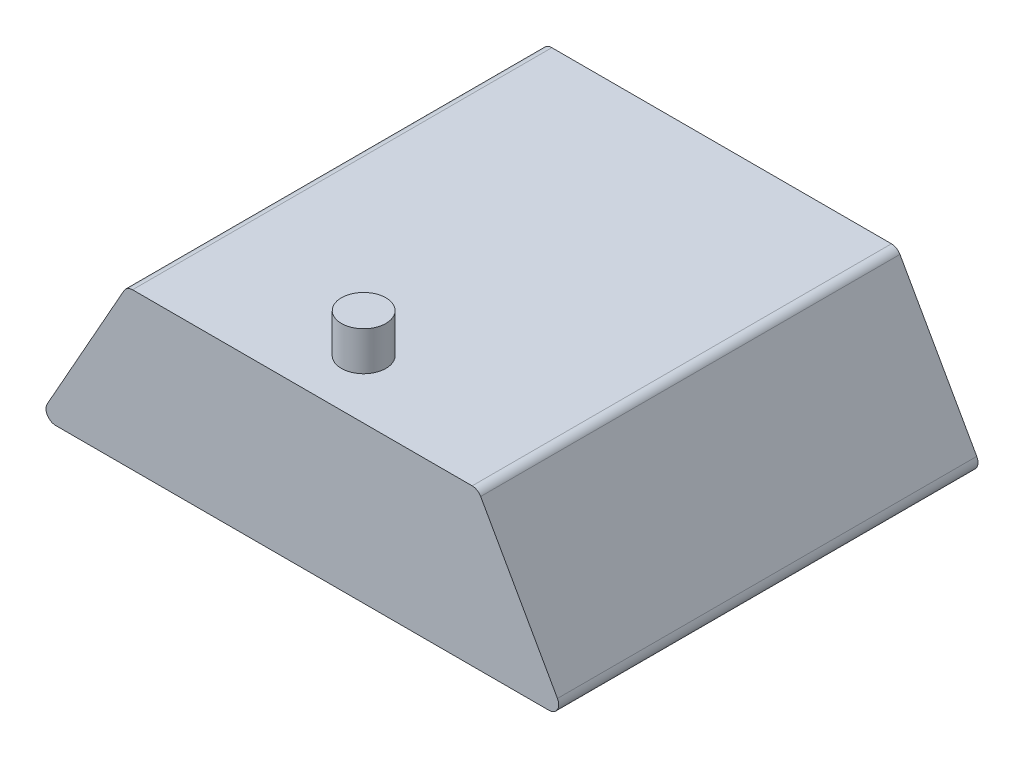
ISO-10303-21;
HEADER;
FILE_DESCRIPTION(('STEP AP214'),'2;1');
FILE_NAME('part.step','',(''),(''),'','','');
FILE_SCHEMA(('AUTOMOTIVE_DESIGN { 1 0 10303 214 1 1 1 1 }'));
ENDSEC;
DATA;
#1=APPLICATION_CONTEXT('core data for automotive mechanical design processes');
#2=APPLICATION_PROTOCOL_DEFINITION('international standard','automotive_design',2000,#1);
#3=PRODUCT_CONTEXT('',#1,'mechanical');
#4=PRODUCT('Part','Part','',(#3));
#5=PRODUCT_RELATED_PRODUCT_CATEGORY('part','',(#4));
#6=PRODUCT_DEFINITION_FORMATION('','',#4);
#7=PRODUCT_DEFINITION_CONTEXT('part definition',#1,'design');
#8=PRODUCT_DEFINITION('design','',#6,#7);
#9=PRODUCT_DEFINITION_SHAPE('','',#8);
#10=(LENGTH_UNIT() NAMED_UNIT(*) SI_UNIT(.MILLI.,.METRE.));
#11=(NAMED_UNIT(*) PLANE_ANGLE_UNIT() SI_UNIT($,.RADIAN.));
#12=(NAMED_UNIT(*) SI_UNIT($,.STERADIAN.) SOLID_ANGLE_UNIT());
#13=UNCERTAINTY_MEASURE_WITH_UNIT(LENGTH_MEASURE(1.E-05),#10,'distance_accuracy_value','');
#14=(GEOMETRIC_REPRESENTATION_CONTEXT(3) GLOBAL_UNCERTAINTY_ASSIGNED_CONTEXT((#13)) GLOBAL_UNIT_ASSIGNED_CONTEXT((#10,
#11,#12)) REPRESENTATION_CONTEXT('',''));
#15=CARTESIAN_POINT('',(0.,0.,0.));
#16=DIRECTION('',(0.,0.,1.));
#17=DIRECTION('',(1.,0.,0.));
#18=AXIS2_PLACEMENT_3D('',#15,#16,#17);
#19=CARTESIAN_POINT('',(-87.0757625779107,0.779496677197986,215.));
#20=DIRECTION('',(0.,0.,-1.));
#21=DIRECTION('',(-1.,0.,0.));
#22=AXIS2_PLACEMENT_3D('',#19,#20,#21);
#23=CYLINDRICAL_SURFACE('',#22,5.);
#24=CARTESIAN_POINT('',(-87.0757625779107,0.779496677197986,0.));
#25=DIRECTION('',(0.,0.,-1.));
#26=DIRECTION('',(-1.,0.,0.));
#27=AXIS2_PLACEMENT_3D('',#24,#25,#26);
#28=CIRCLE('',#27,5.);
#29=CARTESIAN_POINT('',(-91.4336402635334,3.23080287536078,0.));
#30=VERTEX_POINT('',#29);
#31=CARTESIAN_POINT('',(-87.0757625779107,5.77949667719799,0.));
#32=VERTEX_POINT('',#31);
#33=EDGE_CURVE('E135',#30,#32,#28,.T.);
#34=ORIENTED_EDGE('',*,*,#33,.F.);
#35=DIRECTION('',(0.,0.,-1.));
#36=VECTOR('',#35,1.);
#37=CARTESIAN_POINT('',(-91.4336402635334,3.23080287536078,215.));
#38=LINE('',#37,#36);
#39=CARTESIAN_POINT('',(-91.4336402635334,3.23080287536078,215.));
#40=VERTEX_POINT('',#39);
#41=EDGE_CURVE('E55',#40,#30,#38,.T.);
#42=ORIENTED_EDGE('',*,*,#41,.F.);
#43=CARTESIAN_POINT('',(-87.0757625779107,0.779496677197986,215.));
#44=DIRECTION('',(0.,0.,-1.));
#45=DIRECTION('',(-1.,0.,0.));
#46=AXIS2_PLACEMENT_3D('',#43,#44,#45);
#47=CIRCLE('',#46,5.);
#48=CARTESIAN_POINT('',(-87.0757625779107,5.77949667719799,215.));
#49=VERTEX_POINT('',#48);
#50=EDGE_CURVE('E157',#40,#49,#47,.T.);
#51=ORIENTED_EDGE('',*,*,#50,.T.);
#52=DIRECTION('',(0.,0.,-1.));
#53=VECTOR('',#52,1.);
#54=CARTESIAN_POINT('',(-87.0757625779107,5.77949667719799,215.));
#55=LINE('',#54,#53);
#56=EDGE_CURVE('E96',#49,#32,#55,.T.);
#57=ORIENTED_EDGE('',*,*,#56,.T.);
#58=EDGE_LOOP('',(#34,#42,#51,#57));
#59=FACE_BOUND('',#58,.T.);
#60=ADVANCED_FACE('F39',(#59),#23,.T.);
#61=CARTESIAN_POINT('',(-130.808640263533,-66.7691971246392,215.));
#62=DIRECTION('',(-0.871575537124549,0.490261239632559,0.));
#63=DIRECTION('',(-0.490261239632559,-0.871575537124549,0.));
#64=AXIS2_PLACEMENT_3D('',#61,#62,#63);
#65=PLANE('',#64);
#66=DIRECTION('',(0.490261239632559,0.871575537124549,0.));
#67=VECTOR('',#66,1.);
#68=CARTESIAN_POINT('',(-130.808640263533,-66.7691971246392,0.));
#69=LINE('',#68,#67);
#70=CARTESIAN_POINT('',(-130.808640263533,-66.7691971246392,0.));
#71=VERTEX_POINT('',#70);
#72=EDGE_CURVE('E154',#71,#30,#69,.T.);
#73=ORIENTED_EDGE('',*,*,#72,.F.);
#74=DIRECTION('',(0.,0.,-1.));
#75=VECTOR('',#74,1.);
#76=CARTESIAN_POINT('',(-130.808640263533,-66.7691971246392,215.));
#77=LINE('',#76,#75);
#78=CARTESIAN_POINT('',(-130.808640263533,-66.7691971246392,215.));
#79=VERTEX_POINT('',#78);
#80=EDGE_CURVE('E84',#79,#71,#77,.T.);
#81=ORIENTED_EDGE('',*,*,#80,.F.);
#82=DIRECTION('',(0.490261239632559,0.871575537124549,0.));
#83=VECTOR('',#82,1.);
#84=CARTESIAN_POINT('',(-130.808640263533,-66.7691971246392,215.));
#85=LINE('',#84,#83);
#86=EDGE_CURVE('E130',#79,#40,#85,.T.);
#87=ORIENTED_EDGE('',*,*,#86,.T.);
#88=ORIENTED_EDGE('',*,*,#41,.T.);
#89=EDGE_LOOP('',(#73,#81,#87,#88));
#90=FACE_BOUND('',#89,.T.);
#91=ADVANCED_FACE('F205',(#90),#65,.T.);
#92=CARTESIAN_POINT('',(-126.450762577911,-69.220503322802,215.));
#93=DIRECTION('',(0.,0.,-1.));
#94=DIRECTION('',(-1.,0.,0.));
#95=AXIS2_PLACEMENT_3D('',#92,#93,#94);
#96=CYLINDRICAL_SURFACE('',#95,5.00000000000002);
#97=CARTESIAN_POINT('',(-126.450762577911,-69.220503322802,0.));
#98=DIRECTION('',(0.,0.,-1.));
#99=DIRECTION('',(-1.,0.,0.));
#100=AXIS2_PLACEMENT_3D('',#97,#98,#99);
#101=CIRCLE('',#100,5.00000000000002);
#102=CARTESIAN_POINT('',(-126.450762577911,-74.220503322802,0.));
#103=VERTEX_POINT('',#102);
#104=EDGE_CURVE('E116',#103,#71,#101,.T.);
#105=ORIENTED_EDGE('',*,*,#104,.F.);
#106=DIRECTION('',(0.,0.,-1.));
#107=VECTOR('',#106,1.);
#108=CARTESIAN_POINT('',(-126.450762577911,-74.220503322802,215.));
#109=LINE('',#108,#107);
#110=CARTESIAN_POINT('',(-126.450762577911,-74.220503322802,215.));
#111=VERTEX_POINT('',#110);
#112=EDGE_CURVE('E110',#111,#103,#109,.T.);
#113=ORIENTED_EDGE('',*,*,#112,.F.);
#114=CARTESIAN_POINT('',(-126.450762577911,-69.220503322802,215.));
#115=DIRECTION('',(0.,0.,-1.));
#116=DIRECTION('',(-1.,0.,0.));
#117=AXIS2_PLACEMENT_3D('',#114,#115,#116);
#118=CIRCLE('',#117,5.00000000000002);
#119=EDGE_CURVE('E114',#111,#79,#118,.T.);
#120=ORIENTED_EDGE('',*,*,#119,.T.);
#121=ORIENTED_EDGE('',*,*,#80,.T.);
#122=EDGE_LOOP('',(#105,#113,#120,#121));
#123=FACE_BOUND('',#122,.T.);
#124=ADVANCED_FACE('F112',(#123),#96,.T.);
#125=CARTESIAN_POINT('',(-126.450762577911,-74.220503322802,215.));
#126=DIRECTION('',(0.,1.,0.));
#127=DIRECTION('',(-1.,0.,0.));
#128=AXIS2_PLACEMENT_3D('',#125,#126,#127);
#129=PLANE('',#128);
#130=CARTESIAN_POINT('',(100.,-74.220503322802,185.989670210691));
#131=DIRECTION('',(0.,1.,0.));
#132=DIRECTION('',(-1.,0.,0.));
#133=AXIS2_PLACEMENT_3D('',#130,#131,#132);
#134=CIRCLE('',#133,12.5);
#135=CARTESIAN_POINT('',(87.5,-74.220503322802,185.989670210691));
#136=VERTEX_POINT('',#135);
#137=EDGE_CURVE('E12',#136,#136,#134,.F.);
#138=ORIENTED_EDGE('',*,*,#137,.F.);
#139=EDGE_LOOP('',(#138));
#140=FACE_BOUND('',#139,.T.);
#141=CARTESIAN_POINT('',(100.,-74.220503322802,29.0103297893086));
#142=DIRECTION('',(0.,1.,0.));
#143=DIRECTION('',(-1.,0.,0.));
#144=AXIS2_PLACEMENT_3D('',#141,#142,#143);
#145=CIRCLE('',#144,12.5);
#146=CARTESIAN_POINT('',(87.5,-74.220503322802,29.0103297893086));
#147=VERTEX_POINT('',#146);
#148=EDGE_CURVE('E47',#147,#147,#145,.F.);
#149=ORIENTED_EDGE('',*,*,#148,.F.);
#150=EDGE_LOOP('',(#149));
#151=FACE_BOUND('',#150,.T.);
#152=CARTESIAN_POINT('',(-100.,-74.220503322802,29.0103297893086));
#153=DIRECTION('',(0.,1.,0.));
#154=DIRECTION('',(-1.,0.,0.));
#155=AXIS2_PLACEMENT_3D('',#152,#153,#154);
#156=CIRCLE('',#155,12.5);
#157=CARTESIAN_POINT('',(-112.5,-74.220503322802,29.0103297893086));
#158=VERTEX_POINT('',#157);
#159=EDGE_CURVE('E171',#158,#158,#156,.F.);
#160=ORIENTED_EDGE('',*,*,#159,.F.);
#161=EDGE_LOOP('',(#160));
#162=FACE_BOUND('',#161,.T.);
#163=CARTESIAN_POINT('',(-100.,-74.220503322802,185.989670210691));
#164=DIRECTION('',(0.,1.,0.));
#165=DIRECTION('',(-1.,0.,0.));
#166=AXIS2_PLACEMENT_3D('',#163,#164,#165);
#167=CIRCLE('',#166,12.5);
#168=CARTESIAN_POINT('',(-112.5,-74.220503322802,185.989670210691));
#169=VERTEX_POINT('',#168);
#170=EDGE_CURVE('E159',#169,#169,#167,.F.);
#171=ORIENTED_EDGE('',*,*,#170,.F.);
#172=EDGE_LOOP('',(#171));
#173=FACE_BOUND('',#172,.T.);
#174=DIRECTION('',(1.,0.,0.));
#175=VECTOR('',#174,1.);
#176=CARTESIAN_POINT('',(-126.450762577911,-74.220503322802,0.));
#177=LINE('',#176,#175);
#178=CARTESIAN_POINT('',(126.450762577911,-74.220503322802,0.));
#179=VERTEX_POINT('',#178);
#180=EDGE_CURVE('E151',#103,#179,#177,.T.);
#181=ORIENTED_EDGE('',*,*,#180,.T.);
#182=DIRECTION('',(0.,0.,-1.));
#183=VECTOR('',#182,1.);
#184=CARTESIAN_POINT('',(126.450762577911,-74.220503322802,215.));
#185=LINE('',#184,#183);
#186=CARTESIAN_POINT('',(126.450762577911,-74.220503322802,215.));
#187=VERTEX_POINT('',#186);
#188=EDGE_CURVE('E119',#187,#179,#185,.T.);
#189=ORIENTED_EDGE('',*,*,#188,.F.);
#190=DIRECTION('',(1.,0.,0.));
#191=VECTOR('',#190,1.);
#192=CARTESIAN_POINT('',(-126.450762577911,-74.220503322802,215.));
#193=LINE('',#192,#191);
#194=EDGE_CURVE('E122',#111,#187,#193,.T.);
#195=ORIENTED_EDGE('',*,*,#194,.F.);
#196=ORIENTED_EDGE('',*,*,#112,.T.);
#197=EDGE_LOOP('',(#181,#189,#195,#196));
#198=FACE_BOUND('',#197,.T.);
#199=ADVANCED_FACE('F123',(#140,#151,#162,#173,#198),#129,.F.);
#200=CARTESIAN_POINT('',(126.450762577911,-69.220503322802,215.));
#201=DIRECTION('',(0.,0.,-1.));
#202=DIRECTION('',(-1.,0.,0.));
#203=AXIS2_PLACEMENT_3D('',#200,#201,#202);
#204=CYLINDRICAL_SURFACE('',#203,5.00000000000001);
#205=CARTESIAN_POINT('',(126.450762577911,-69.220503322802,0.));
#206=DIRECTION('',(0.,0.,1.));
#207=DIRECTION('',(1.,0.,0.));
#208=AXIS2_PLACEMENT_3D('',#205,#206,#207);
#209=CIRCLE('',#208,5.00000000000001);
#210=CARTESIAN_POINT('',(130.808640263533,-66.7691971246392,0.));
#211=VERTEX_POINT('',#210);
#212=EDGE_CURVE('E148',#179,#211,#209,.T.);
#213=ORIENTED_EDGE('',*,*,#212,.T.);
#214=DIRECTION('',(0.,0.,-1.));
#215=VECTOR('',#214,1.);
#216=CARTESIAN_POINT('',(130.808640263533,-66.7691971246392,215.));
#217=LINE('',#216,#215);
#218=CARTESIAN_POINT('',(130.808640263533,-66.7691971246392,215.));
#219=VERTEX_POINT('',#218);
#220=EDGE_CURVE('E162',#219,#211,#217,.T.);
#221=ORIENTED_EDGE('',*,*,#220,.F.);
#222=CARTESIAN_POINT('',(126.450762577911,-69.220503322802,215.));
#223=DIRECTION('',(0.,0.,1.));
#224=DIRECTION('',(1.,0.,0.));
#225=AXIS2_PLACEMENT_3D('',#222,#223,#224);
#226=CIRCLE('',#225,5.00000000000001);
#227=EDGE_CURVE('E127',#187,#219,#226,.T.);
#228=ORIENTED_EDGE('',*,*,#227,.F.);
#229=ORIENTED_EDGE('',*,*,#188,.T.);
#230=EDGE_LOOP('',(#213,#221,#228,#229));
#231=FACE_BOUND('',#230,.T.);
#232=ADVANCED_FACE('F180',(#231),#204,.T.);
#233=CARTESIAN_POINT('',(91.4336402635334,3.23080287536078,215.));
#234=DIRECTION('',(0.871575537124549,0.490261239632559,0.));
#235=DIRECTION('',(-0.490261239632559,0.871575537124549,0.));
#236=AXIS2_PLACEMENT_3D('',#233,#234,#235);
#237=PLANE('',#236);
#238=DIRECTION('',(0.490261239632559,-0.871575537124549,0.));
#239=VECTOR('',#238,1.);
#240=CARTESIAN_POINT('',(91.4336402635334,3.23080287536078,0.));
#241=LINE('',#240,#239);
#242=CARTESIAN_POINT('',(91.4336402635334,3.23080287536078,0.));
#243=VERTEX_POINT('',#242);
#244=EDGE_CURVE('E145',#243,#211,#241,.T.);
#245=ORIENTED_EDGE('',*,*,#244,.F.);
#246=DIRECTION('',(0.,0.,-1.));
#247=VECTOR('',#246,1.);
#248=CARTESIAN_POINT('',(91.4336402635334,3.23080287536078,215.));
#249=LINE('',#248,#247);
#250=CARTESIAN_POINT('',(91.4336402635334,3.23080287536078,215.));
#251=VERTEX_POINT('',#250);
#252=EDGE_CURVE('E164',#251,#243,#249,.T.);
#253=ORIENTED_EDGE('',*,*,#252,.F.);
#254=DIRECTION('',(0.490261239632559,-0.871575537124549,0.));
#255=VECTOR('',#254,1.);
#256=CARTESIAN_POINT('',(91.4336402635334,3.23080287536078,215.));
#257=LINE('',#256,#255);
#258=EDGE_CURVE('E215',#251,#219,#257,.T.);
#259=ORIENTED_EDGE('',*,*,#258,.T.);
#260=ORIENTED_EDGE('',*,*,#220,.T.);
#261=EDGE_LOOP('',(#245,#253,#259,#260));
#262=FACE_BOUND('',#261,.T.);
#263=ADVANCED_FACE('F258',(#262),#237,.T.);
#264=CARTESIAN_POINT('',(87.0757625779107,0.779496677197986,215.));
#265=DIRECTION('',(0.,0.,-1.));
#266=DIRECTION('',(-1.,0.,0.));
#267=AXIS2_PLACEMENT_3D('',#264,#265,#266);
#268=CYLINDRICAL_SURFACE('',#267,4.99999999999999);
#269=CARTESIAN_POINT('',(87.0757625779107,0.779496677197986,0.));
#270=DIRECTION('',(0.,0.,1.));
#271=DIRECTION('',(1.,0.,0.));
#272=AXIS2_PLACEMENT_3D('',#269,#270,#271);
#273=CIRCLE('',#272,4.99999999999999);
#274=CARTESIAN_POINT('',(87.0757625779107,5.77949667719799,0.));
#275=VERTEX_POINT('',#274);
#276=EDGE_CURVE('E142',#243,#275,#273,.T.);
#277=ORIENTED_EDGE('',*,*,#276,.T.);
#278=DIRECTION('',(0.,0.,-1.));
#279=VECTOR('',#278,1.);
#280=CARTESIAN_POINT('',(87.0757625779107,5.77949667719799,215.));
#281=LINE('',#280,#279);
#282=CARTESIAN_POINT('',(87.0757625779107,5.77949667719799,215.));
#283=VERTEX_POINT('',#282);
#284=EDGE_CURVE('E166',#283,#275,#281,.T.);
#285=ORIENTED_EDGE('',*,*,#284,.F.);
#286=CARTESIAN_POINT('',(87.0757625779107,0.779496677197986,215.));
#287=DIRECTION('',(0.,0.,1.));
#288=DIRECTION('',(1.,0.,0.));
#289=AXIS2_PLACEMENT_3D('',#286,#287,#288);
#290=CIRCLE('',#289,4.99999999999999);
#291=EDGE_CURVE('E216',#251,#283,#290,.T.);
#292=ORIENTED_EDGE('',*,*,#291,.F.);
#293=ORIENTED_EDGE('',*,*,#252,.T.);
#294=EDGE_LOOP('',(#277,#285,#292,#293));
#295=FACE_BOUND('',#294,.T.);
#296=ADVANCED_FACE('F252',(#295),#268,.T.);
#297=CARTESIAN_POINT('',(-87.0757625779107,5.77949667719799,215.));
#298=DIRECTION('',(0.,1.,0.));
#299=DIRECTION('',(0.,0.,1.));
#300=AXIS2_PLACEMENT_3D('',#297,#298,#299);
#301=PLANE('',#300);
#302=CARTESIAN_POINT('',(1.43364026353342,5.77949667719799,185.));
#303=DIRECTION('',(0.,1.,0.));
#304=DIRECTION('',(0.,0.,1.));
#305=AXIS2_PLACEMENT_3D('',#302,#303,#304);
#306=CIRCLE('',#305,11.4043745204871);
#307=CARTESIAN_POINT('',(1.43364026353342,5.77949667719799,196.404374520487));
#308=VERTEX_POINT('',#307);
#309=EDGE_CURVE('E235',#308,#308,#306,.T.);
#310=ORIENTED_EDGE('',*,*,#309,.F.);
#311=EDGE_LOOP('',(#310));
#312=FACE_BOUND('',#311,.T.);
#313=DIRECTION('',(1.,0.,0.));
#314=VECTOR('',#313,1.);
#315=CARTESIAN_POINT('',(-87.0757625779107,5.77949667719799,0.));
#316=LINE('',#315,#314);
#317=EDGE_CURVE('E138',#32,#275,#316,.T.);
#318=ORIENTED_EDGE('',*,*,#317,.F.);
#319=ORIENTED_EDGE('',*,*,#56,.F.);
#320=DIRECTION('',(1.,0.,0.));
#321=VECTOR('',#320,1.);
#322=CARTESIAN_POINT('',(-87.0757625779107,5.77949667719799,215.));
#323=LINE('',#322,#321);
#324=EDGE_CURVE('E220',#49,#283,#323,.T.);
#325=ORIENTED_EDGE('',*,*,#324,.T.);
#326=ORIENTED_EDGE('',*,*,#284,.T.);
#327=EDGE_LOOP('',(#318,#319,#325,#326));
#328=FACE_BOUND('',#327,.T.);
#329=ADVANCED_FACE('F250',(#312,#328),#301,.T.);
#330=CARTESIAN_POINT('',(-87.0757625779107,0.779496677197986,215.));
#331=DIRECTION('',(0.,0.,-1.));
#332=DIRECTION('',(-1.,0.,0.));
#333=AXIS2_PLACEMENT_3D('',#330,#331,#332);
#334=PLANE('',#333);
#335=ORIENTED_EDGE('',*,*,#50,.F.);
#336=ORIENTED_EDGE('',*,*,#86,.F.);
#337=ORIENTED_EDGE('',*,*,#119,.F.);
#338=ORIENTED_EDGE('',*,*,#194,.T.);
#339=ORIENTED_EDGE('',*,*,#227,.T.);
#340=ORIENTED_EDGE('',*,*,#258,.F.);
#341=ORIENTED_EDGE('',*,*,#291,.T.);
#342=ORIENTED_EDGE('',*,*,#324,.F.);
#343=EDGE_LOOP('',(#335,#336,#337,#338,#339,#340,#341,#342));
#344=FACE_BOUND('',#343,.T.);
#345=ADVANCED_FACE('F129',(#344),#334,.F.);
#346=CARTESIAN_POINT('',(-87.0757625779107,0.779496677197986,0.));
#347=DIRECTION('',(0.,0.,-1.));
#348=DIRECTION('',(-1.,0.,0.));
#349=AXIS2_PLACEMENT_3D('',#346,#347,#348);
#350=PLANE('',#349);
#351=ORIENTED_EDGE('',*,*,#33,.T.);
#352=ORIENTED_EDGE('',*,*,#317,.T.);
#353=ORIENTED_EDGE('',*,*,#276,.F.);
#354=ORIENTED_EDGE('',*,*,#244,.T.);
#355=ORIENTED_EDGE('',*,*,#212,.F.);
#356=ORIENTED_EDGE('',*,*,#180,.F.);
#357=ORIENTED_EDGE('',*,*,#104,.T.);
#358=ORIENTED_EDGE('',*,*,#72,.T.);
#359=EDGE_LOOP('',(#351,#352,#353,#354,#355,#356,#357,#358));
#360=FACE_BOUND('',#359,.T.);
#361=ADVANCED_FACE('F190',(#360),#350,.T.);
#362=CARTESIAN_POINT('',(-100.,-74.220503322802,185.989670210691));
#363=DIRECTION('',(0.,1.,0.));
#364=DIRECTION('',(0.,0.,-1.));
#365=AXIS2_PLACEMENT_3D('',#362,#363,#364);
#366=CONICAL_SURFACE('',#365,12.5,0.26179938779915);
#367=CARTESIAN_POINT('',(-100.,-84.220503322802,185.989670210691));
#368=DIRECTION('',(0.,-1.,0.));
#369=DIRECTION('',(0.,0.,-1.));
#370=AXIS2_PLACEMENT_3D('',#367,#368,#369);
#371=CIRCLE('',#370,9.82050807568879);
#372=CARTESIAN_POINT('',(-100.,-84.220503322802,176.169162135003));
#373=VERTEX_POINT('',#372);
#374=EDGE_CURVE('E139',#373,#373,#371,.T.);
#375=ORIENTED_EDGE('',*,*,#374,.F.);
#376=EDGE_LOOP('',(#375));
#377=FACE_BOUND('',#376,.T.);
#378=ORIENTED_EDGE('',*,*,#170,.T.);
#379=EDGE_LOOP('',(#378));
#380=FACE_BOUND('',#379,.T.);
#381=ADVANCED_FACE('F187',(#377,#380),#366,.T.);
#382=CARTESIAN_POINT('',(-100.,-84.220503322802,185.989670210691));
#383=DIRECTION('',(0.,-1.,0.));
#384=DIRECTION('',(0.,0.,-1.));
#385=AXIS2_PLACEMENT_3D('',#382,#383,#384);
#386=PLANE('',#385);
#387=ORIENTED_EDGE('',*,*,#374,.T.);
#388=EDGE_LOOP('',(#387));
#389=FACE_BOUND('',#388,.T.);
#390=ADVANCED_FACE('F189',(#389),#386,.T.);
#391=CARTESIAN_POINT('',(-100.,-74.220503322802,29.0103297893086));
#392=DIRECTION('',(0.,1.,0.));
#393=DIRECTION('',(0.,0.,1.));
#394=AXIS2_PLACEMENT_3D('',#391,#392,#393);
#395=CONICAL_SURFACE('',#394,12.5,0.26179938779915);
#396=CARTESIAN_POINT('',(-100.,-84.220503322802,29.0103297893086));
#397=DIRECTION('',(0.,1.,0.));
#398=DIRECTION('',(0.,0.,1.));
#399=AXIS2_PLACEMENT_3D('',#396,#397,#398);
#400=CIRCLE('',#399,9.82050807568877);
#401=CARTESIAN_POINT('',(-100.,-84.220503322802,38.8308378649974));
#402=VERTEX_POINT('',#401);
#403=EDGE_CURVE('E225',#402,#402,#400,.F.);
#404=ORIENTED_EDGE('',*,*,#403,.F.);
#405=EDGE_LOOP('',(#404));
#406=FACE_BOUND('',#405,.T.);
#407=ORIENTED_EDGE('',*,*,#159,.T.);
#408=EDGE_LOOP('',(#407));
#409=FACE_BOUND('',#408,.T.);
#410=ADVANCED_FACE('F197',(#406,#409),#395,.T.);
#411=CARTESIAN_POINT('',(-100.,-84.220503322802,29.0103297893086));
#412=DIRECTION('',(0.,1.,0.));
#413=DIRECTION('',(0.,0.,1.));
#414=AXIS2_PLACEMENT_3D('',#411,#412,#413);
#415=PLANE('',#414);
#416=ORIENTED_EDGE('',*,*,#403,.T.);
#417=EDGE_LOOP('',(#416));
#418=FACE_BOUND('',#417,.T.);
#419=ADVANCED_FACE('F306',(#418),#415,.F.);
#420=CARTESIAN_POINT('',(100.,-74.220503322802,29.0103297893086));
#421=DIRECTION('',(0.,1.,0.));
#422=DIRECTION('',(0.,0.,-1.));
#423=AXIS2_PLACEMENT_3D('',#420,#421,#422);
#424=CONICAL_SURFACE('',#423,12.5,0.26179938779915);
#425=CARTESIAN_POINT('',(100.,-84.220503322802,29.0103297893086));
#426=DIRECTION('',(0.,-1.,0.));
#427=DIRECTION('',(0.,0.,-1.));
#428=AXIS2_PLACEMENT_3D('',#425,#426,#427);
#429=CIRCLE('',#428,9.82050807568877);
#430=CARTESIAN_POINT('',(100.,-84.220503322802,19.1898217136198));
#431=VERTEX_POINT('',#430);
#432=EDGE_CURVE('E228',#431,#431,#429,.T.);
#433=ORIENTED_EDGE('',*,*,#432,.F.);
#434=EDGE_LOOP('',(#433));
#435=FACE_BOUND('',#434,.T.);
#436=ORIENTED_EDGE('',*,*,#148,.T.);
#437=EDGE_LOOP('',(#436));
#438=FACE_BOUND('',#437,.T.);
#439=ADVANCED_FACE('F176',(#435,#438),#424,.T.);
#440=CARTESIAN_POINT('',(100.,-84.220503322802,29.0103297893086));
#441=DIRECTION('',(0.,-1.,0.));
#442=DIRECTION('',(0.,0.,-1.));
#443=AXIS2_PLACEMENT_3D('',#440,#441,#442);
#444=PLANE('',#443);
#445=ORIENTED_EDGE('',*,*,#432,.T.);
#446=EDGE_LOOP('',(#445));
#447=FACE_BOUND('',#446,.T.);
#448=ADVANCED_FACE('F325',(#447),#444,.T.);
#449=CARTESIAN_POINT('',(100.,-74.220503322802,185.989670210691));
#450=DIRECTION('',(0.,1.,0.));
#451=DIRECTION('',(0.,0.,1.));
#452=AXIS2_PLACEMENT_3D('',#449,#450,#451);
#453=CONICAL_SURFACE('',#452,12.5,0.26179938779915);
#454=CARTESIAN_POINT('',(100.,-84.220503322802,185.989670210691));
#455=DIRECTION('',(0.,1.,0.));
#456=DIRECTION('',(0.,0.,1.));
#457=AXIS2_PLACEMENT_3D('',#454,#455,#456);
#458=CIRCLE('',#457,9.82050807568879);
#459=CARTESIAN_POINT('',(100.,-84.220503322802,195.81017828638));
#460=VERTEX_POINT('',#459);
#461=EDGE_CURVE('E231',#460,#460,#458,.F.);
#462=ORIENTED_EDGE('',*,*,#461,.F.);
#463=EDGE_LOOP('',(#462));
#464=FACE_BOUND('',#463,.T.);
#465=ORIENTED_EDGE('',*,*,#137,.T.);
#466=EDGE_LOOP('',(#465));
#467=FACE_BOUND('',#466,.T.);
#468=ADVANCED_FACE('F335',(#464,#467),#453,.T.);
#469=CARTESIAN_POINT('',(100.,-84.220503322802,185.989670210691));
#470=DIRECTION('',(0.,1.,0.));
#471=DIRECTION('',(0.,0.,1.));
#472=AXIS2_PLACEMENT_3D('',#469,#470,#471);
#473=PLANE('',#472);
#474=ORIENTED_EDGE('',*,*,#461,.T.);
#475=EDGE_LOOP('',(#474));
#476=FACE_BOUND('',#475,.T.);
#477=ADVANCED_FACE('F246',(#476),#473,.F.);
#478=CARTESIAN_POINT('',(1.43364026353342,25.779496677198,185.));
#479=DIRECTION('',(0.,-1.,0.));
#480=DIRECTION('',(0.,0.,-1.));
#481=AXIS2_PLACEMENT_3D('',#478,#479,#480);
#482=CYLINDRICAL_SURFACE('',#481,11.4043745204871);
#483=CARTESIAN_POINT('',(1.43364026353342,25.779496677198,185.));
#484=DIRECTION('',(0.,1.,0.));
#485=DIRECTION('',(0.,0.,1.));
#486=AXIS2_PLACEMENT_3D('',#483,#484,#485);
#487=CIRCLE('',#486,11.4043745204871);
#488=CARTESIAN_POINT('',(1.43364026353342,25.779496677198,196.404374520487));
#489=VERTEX_POINT('',#488);
#490=EDGE_CURVE('E234',#489,#489,#487,.T.);
#491=ORIENTED_EDGE('',*,*,#490,.F.);
#492=EDGE_LOOP('',(#491));
#493=FACE_BOUND('',#492,.T.);
#494=ORIENTED_EDGE('',*,*,#309,.T.);
#495=EDGE_LOOP('',(#494));
#496=FACE_BOUND('',#495,.T.);
#497=ADVANCED_FACE('F243',(#493,#496),#482,.T.);
#498=CARTESIAN_POINT('',(1.43364026353342,25.779496677198,185.));
#499=DIRECTION('',(0.,1.,0.));
#500=DIRECTION('',(0.,0.,1.));
#501=AXIS2_PLACEMENT_3D('',#498,#499,#500);
#502=PLANE('',#501);
#503=ORIENTED_EDGE('',*,*,#490,.T.);
#504=EDGE_LOOP('',(#503));
#505=FACE_BOUND('',#504,.T.);
#506=ADVANCED_FACE('F241',(#505),#502,.T.);
#507=CLOSED_SHELL('',(#60,#91,#124,#199,#232,#263,#296,#329,#345,#361,#381,#390,#410,#419,#439,
#448,#468,#477,#497,#506));
#508=MANIFOLD_SOLID_BREP('B2',#507);
#509=ADVANCED_BREP_SHAPE_REPRESENTATION('',(#18,#508),#14);
#510=SHAPE_DEFINITION_REPRESENTATION(#9,#509);
ENDSEC;
END-ISO-10303-21;
